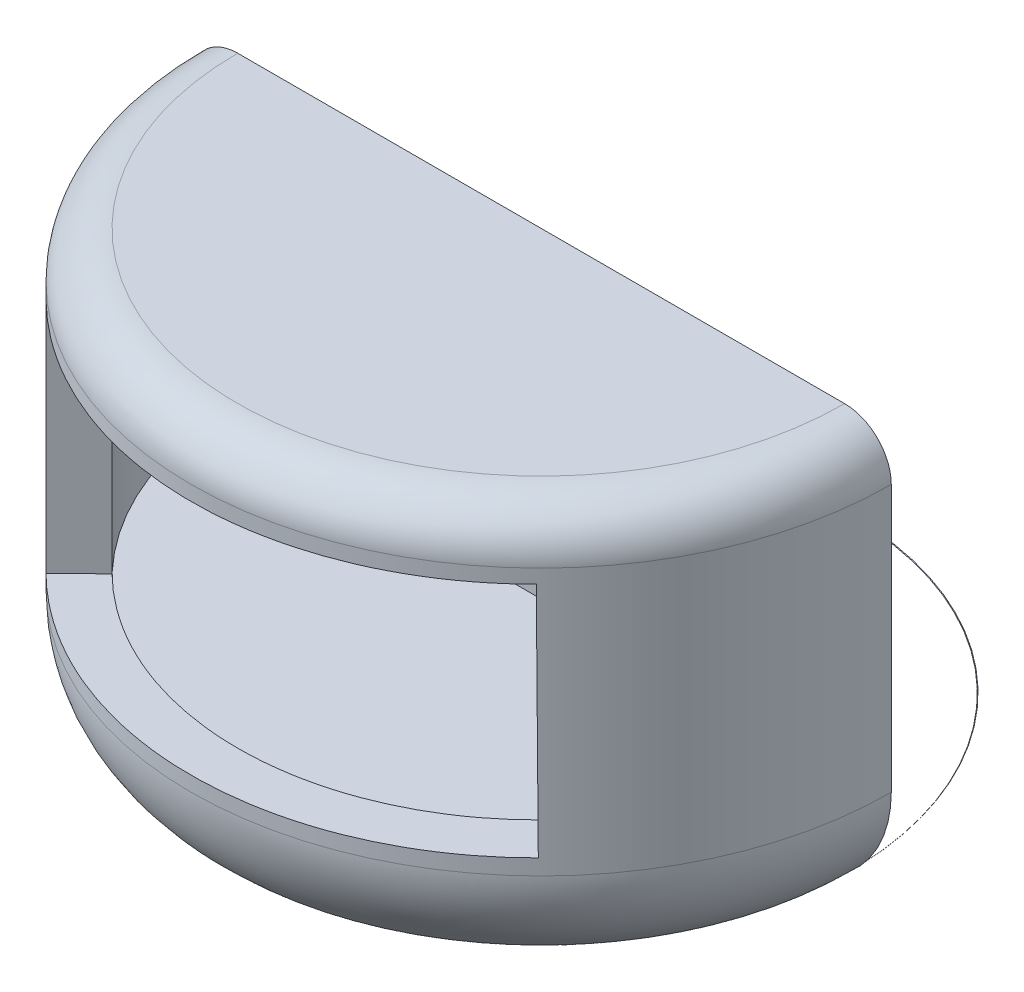
ISO-10303-21;
HEADER;
FILE_DESCRIPTION(('STEP AP214'),'2;1');
FILE_NAME('part.step','',(''),(''),'','','');
FILE_SCHEMA(('AUTOMOTIVE_DESIGN { 1 0 10303 214 1 1 1 1 }'));
ENDSEC;
DATA;
#1=APPLICATION_CONTEXT('core data for automotive mechanical design processes');
#2=APPLICATION_PROTOCOL_DEFINITION('international standard','automotive_design',2000,#1);
#3=PRODUCT_CONTEXT('',#1,'mechanical');
#4=PRODUCT('Part','Part','',(#3));
#5=PRODUCT_RELATED_PRODUCT_CATEGORY('part','',(#4));
#6=PRODUCT_DEFINITION_FORMATION('','',#4);
#7=PRODUCT_DEFINITION_CONTEXT('part definition',#1,'design');
#8=PRODUCT_DEFINITION('design','',#6,#7);
#9=PRODUCT_DEFINITION_SHAPE('','',#8);
#10=(LENGTH_UNIT() NAMED_UNIT(*) SI_UNIT(.MILLI.,.METRE.));
#11=(NAMED_UNIT(*) PLANE_ANGLE_UNIT() SI_UNIT($,.RADIAN.));
#12=(NAMED_UNIT(*) SI_UNIT($,.STERADIAN.) SOLID_ANGLE_UNIT());
#13=UNCERTAINTY_MEASURE_WITH_UNIT(LENGTH_MEASURE(1.E-05),#10,'distance_accuracy_value','');
#14=(GEOMETRIC_REPRESENTATION_CONTEXT(3) GLOBAL_UNCERTAINTY_ASSIGNED_CONTEXT((#13)) GLOBAL_UNIT_ASSIGNED_CONTEXT((#10,
#11,#12)) REPRESENTATION_CONTEXT('',''));
#15=CARTESIAN_POINT('',(0.,0.,0.));
#16=DIRECTION('',(0.,0.,1.));
#17=DIRECTION('',(1.,0.,0.));
#18=AXIS2_PLACEMENT_3D('',#15,#16,#17);
#19=CARTESIAN_POINT('',(0.,0.,0.));
#20=DIRECTION('',(0.,0.,1.));
#21=DIRECTION('',(1.,0.,0.));
#22=AXIS2_PLACEMENT_3D('',#19,#20,#21);
#23=PLANE('',#22);
#24=DIRECTION('',(0.,-1.,0.));
#25=VECTOR('',#24,1.);
#26=CARTESIAN_POINT('',(-30.,0.,0.));
#27=LINE('',#26,#25);
#28=CARTESIAN_POINT('',(-30.,27.1583373621054,0.));
#29=VERTEX_POINT('',#28);
#30=CARTESIAN_POINT('',(-30.,49.9999999999736,0.));
#31=VERTEX_POINT('',#30);
#32=EDGE_CURVE('E54',#29,#31,#27,.F.);
#33=ORIENTED_EDGE('',*,*,#32,.T.);
#34=CARTESIAN_POINT('',(-26.,49.9999999999736,0.));
#35=DIRECTION('',(0.,0.,1.));
#36=DIRECTION('',(1.,0.,0.));
#37=AXIS2_PLACEMENT_3D('',#34,#35,#36);
#38=CIRCLE('',#37,4.);
#39=CARTESIAN_POINT('',(-26.,53.9999999999736,0.));
#40=VERTEX_POINT('',#39);
#41=EDGE_CURVE('E130',#31,#40,#38,.F.);
#42=ORIENTED_EDGE('',*,*,#41,.T.);
#43=DIRECTION('',(-1.,0.,0.));
#44=VECTOR('',#43,1.);
#45=CARTESIAN_POINT('',(26.,53.9999999999736,0.));
#46=LINE('',#45,#44);
#47=CARTESIAN_POINT('',(26.,53.9999999999736,0.));
#48=VERTEX_POINT('',#47);
#49=EDGE_CURVE('E154',#48,#40,#46,.T.);
#50=ORIENTED_EDGE('',*,*,#49,.F.);
#51=CARTESIAN_POINT('',(26.,49.9999999999736,0.));
#52=DIRECTION('',(0.,0.,1.));
#53=DIRECTION('',(1.,0.,0.));
#54=AXIS2_PLACEMENT_3D('',#51,#52,#53);
#55=CIRCLE('',#54,4.);
#56=CARTESIAN_POINT('',(30.,49.9999999999736,0.));
#57=VERTEX_POINT('',#56);
#58=EDGE_CURVE('E155',#48,#57,#55,.F.);
#59=ORIENTED_EDGE('',*,*,#58,.T.);
#60=DIRECTION('',(0.,-1.,0.));
#61=VECTOR('',#60,1.);
#62=CARTESIAN_POINT('',(30.,0.,0.));
#63=LINE('',#62,#61);
#64=CARTESIAN_POINT('',(30.,27.1583373621054,0.));
#65=VERTEX_POINT('',#64);
#66=EDGE_CURVE('E138',#57,#65,#63,.T.);
#67=ORIENTED_EDGE('',*,*,#66,.T.);
#68=CARTESIAN_POINT('',(20.,27.1583373621054,0.));
#69=DIRECTION('',(0.,0.,1.));
#70=DIRECTION('',(1.,0.,0.));
#71=AXIS2_PLACEMENT_3D('',#68,#69,#70);
#72=CIRCLE('',#71,10.);
#73=CARTESIAN_POINT('',(26.471866147965,19.5350212488365,0.));
#74=VERTEX_POINT('',#73);
#75=EDGE_CURVE('E293',#65,#74,#72,.F.);
#76=ORIENTED_EDGE('',*,*,#75,.T.);
#77=DIRECTION('',(-1.,0.,0.));
#78=VECTOR('',#77,1.);
#79=CARTESIAN_POINT('',(17.5,19.5350212488365,0.));
#80=LINE('',#79,#78);
#81=CARTESIAN_POINT('',(-26.471866147965,19.5350212488365,0.));
#82=VERTEX_POINT('',#81);
#83=EDGE_CURVE('E13',#74,#82,#80,.T.);
#84=ORIENTED_EDGE('',*,*,#83,.T.);
#85=CARTESIAN_POINT('',(-20.,27.1583373621054,0.));
#86=DIRECTION('',(0.,0.,1.));
#87=DIRECTION('',(1.,0.,0.));
#88=AXIS2_PLACEMENT_3D('',#85,#86,#87);
#89=CIRCLE('',#88,10.);
#90=EDGE_CURVE('E133',#82,#29,#89,.F.);
#91=ORIENTED_EDGE('',*,*,#90,.T.);
#92=EDGE_LOOP('',(#33,#42,#50,#59,#67,#76,#84,#91));
#93=FACE_BOUND('',#92,.T.);
#94=ADVANCED_FACE('F51',(#93),#23,.F.);
#95=CARTESIAN_POINT('',(0.,27.9999999999736,0.));
#96=DIRECTION('',(0.,-1.,0.));
#97=DIRECTION('',(0.,0.,-1.));
#98=AXIS2_PLACEMENT_3D('',#95,#96,#97);
#99=PLANE('',#98);
#100=CARTESIAN_POINT('',(0.,27.9999999999736,0.));
#101=DIRECTION('',(0.,-1.,0.));
#102=DIRECTION('',(0.,0.,-1.));
#103=AXIS2_PLACEMENT_3D('',#100,#101,#102);
#104=CIRCLE('',#103,26.);
#105=CARTESIAN_POINT('',(25.9566947048348,27.9999999999736,1.5));
#106=VERTEX_POINT('',#105);
#107=CARTESIAN_POINT('',(-25.9566947048348,27.9999999999736,1.5));
#108=VERTEX_POINT('',#107);
#109=EDGE_CURVE('E265',#106,#108,#104,.T.);
#110=ORIENTED_EDGE('',*,*,#109,.F.);
#111=DIRECTION('',(1.,0.,0.));
#112=VECTOR('',#111,1.);
#113=CARTESIAN_POINT('',(-25.9566947048348,27.9999999999736,1.5));
#114=LINE('',#113,#112);
#115=EDGE_CURVE('E269',#108,#106,#114,.T.);
#116=ORIENTED_EDGE('',*,*,#115,.F.);
#117=EDGE_LOOP('',(#110,#116));
#118=FACE_BOUND('',#117,.T.);
#119=ADVANCED_FACE('F234',(#118),#99,.F.);
#120=CARTESIAN_POINT('',(-25.9566947048348,27.9999999999736,1.5));
#121=DIRECTION('',(0.,0.,1.));
#122=DIRECTION('',(1.,0.,0.));
#123=AXIS2_PLACEMENT_3D('',#120,#121,#122);
#124=PLANE('',#123);
#125=DIRECTION('',(1.,0.,0.));
#126=VECTOR('',#125,1.);
#127=CARTESIAN_POINT('',(-25.9566947048348,49.9999999999736,1.5));
#128=LINE('',#127,#126);
#129=CARTESIAN_POINT('',(-25.9566947048348,49.9999999999736,1.5));
#130=VERTEX_POINT('',#129);
#131=CARTESIAN_POINT('',(25.9566947048348,49.9999999999736,1.5));
#132=VERTEX_POINT('',#131);
#133=EDGE_CURVE('E257',#130,#132,#128,.T.);
#134=ORIENTED_EDGE('',*,*,#133,.F.);
#135=DIRECTION('',(0.,1.,0.));
#136=VECTOR('',#135,1.);
#137=CARTESIAN_POINT('',(-25.9566947048348,27.9999999999736,1.5));
#138=LINE('',#137,#136);
#139=EDGE_CURVE('E160',#108,#130,#138,.T.);
#140=ORIENTED_EDGE('',*,*,#139,.F.);
#141=ORIENTED_EDGE('',*,*,#115,.T.);
#142=DIRECTION('',(0.,1.,0.));
#143=VECTOR('',#142,1.);
#144=CARTESIAN_POINT('',(25.9566947048348,27.9999999999736,1.5));
#145=LINE('',#144,#143);
#146=EDGE_CURVE('E271',#106,#132,#145,.T.);
#147=ORIENTED_EDGE('',*,*,#146,.T.);
#148=EDGE_LOOP('',(#134,#140,#141,#147));
#149=FACE_BOUND('',#148,.T.);
#150=ADVANCED_FACE('F238',(#149),#124,.T.);
#151=CARTESIAN_POINT('',(0.,49.9999999999736,0.));
#152=DIRECTION('',(0.,-1.,0.));
#153=DIRECTION('',(0.,0.,-1.));
#154=AXIS2_PLACEMENT_3D('',#151,#152,#153);
#155=PLANE('',#154);
#156=CARTESIAN_POINT('',(0.,49.9999999999736,0.));
#157=DIRECTION('',(0.,-1.,0.));
#158=DIRECTION('',(0.,0.,-1.));
#159=AXIS2_PLACEMENT_3D('',#156,#157,#158);
#160=CIRCLE('',#159,26.);
#161=EDGE_CURVE('E256',#132,#130,#160,.T.);
#162=ORIENTED_EDGE('',*,*,#161,.T.);
#163=ORIENTED_EDGE('',*,*,#133,.T.);
#164=EDGE_LOOP('',(#162,#163));
#165=FACE_BOUND('',#164,.T.);
#166=ADVANCED_FACE('F243',(#165),#155,.T.);
#167=CARTESIAN_POINT('',(0.,27.9999999999736,0.));
#168=DIRECTION('',(0.,1.,0.));
#169=DIRECTION('',(0.,0.,1.));
#170=AXIS2_PLACEMENT_3D('',#167,#168,#169);
#171=CYLINDRICAL_SURFACE('',#170,26.);
#172=ORIENTED_EDGE('',*,*,#161,.F.);
#173=ORIENTED_EDGE('',*,*,#146,.F.);
#174=ORIENTED_EDGE('',*,*,#109,.T.);
#175=ORIENTED_EDGE('',*,*,#139,.T.);
#176=EDGE_LOOP('',(#172,#173,#174,#175));
#177=FACE_BOUND('',#176,.T.);
#178=CARTESIAN_POINT('',(-18.7417440650638,28.4972696320562,18.0207388694151));
#179=CARTESIAN_POINT('',(-18.4882996910665,28.4949925427919,18.2843241295319));
#180=CARTESIAN_POINT('',(-18.2293213985512,28.492761904993,18.5425323261121));
#181=CARTESIAN_POINT('',(-17.7007135045541,28.4883969978906,19.0477934487578));
#182=CARTESIAN_POINT('',(-17.4310841568819,28.4862627262933,19.2948466403417));
#183=CARTESIAN_POINT('',(-16.6069677604475,28.4800105765759,20.0185657956522));
#184=CARTESIAN_POINT('',(-16.0371209634453,28.4760421833133,20.4779279563515));
#185=CARTESIAN_POINT('',(-14.8611835443312,28.4685374159322,21.3466435161279));
#186=CARTESIAN_POINT('',(-14.2551212327624,28.4650007107669,21.7560352358337));
#187=CARTESIAN_POINT('',(-13.3219773796418,28.4600365514383,22.3306619065837));
#188=CARTESIAN_POINT('',(-13.0069076634661,28.4584385897282,22.515634064853));
#189=CARTESIAN_POINT('',(-12.3691743495986,28.4553583377942,22.8721887698579));
#190=CARTESIAN_POINT('',(-12.0465088263086,28.4538760773216,23.0437678727159));
#191=CARTESIAN_POINT('',(-11.0678943363678,28.449606745937,23.5379643823344));
#192=CARTESIAN_POINT('',(-10.4014091600374,28.446997559641,23.8399906849518));
#193=CARTESIAN_POINT('',(-9.04535501319811,28.4422737051741,24.3868002428154));
#194=CARTESIAN_POINT('',(-8.35578603989758,28.4401590370629,24.6315834911387));
#195=CARTESIAN_POINT('',(-7.30797156898737,28.4373693488168,24.9545035936869));
#196=CARTESIAN_POINT('',(-6.95642106320122,28.4365031048133,25.0547755778289));
#197=CARTESIAN_POINT('',(-6.24949876848898,28.434899592118,25.2403900089665));
#198=CARTESIAN_POINT('',(-5.89412798144716,28.4341622904461,25.3257362735706));
#199=CARTESIAN_POINT('',(-4.82302947503477,28.4321454902131,25.5591907236533));
#200=CARTESIAN_POINT('',(-4.10224602789471,28.4310609112609,25.6847360001692));
#201=CARTESIAN_POINT('',(-2.65276874460171,28.4294202969172,25.874645061075));
#202=CARTESIAN_POINT('',(-1.92407501327557,28.4288642545302,25.9390096552304));
#203=CARTESIAN_POINT('',(-0.463827136891702,28.4282843729651,26.006133749332));
#204=CARTESIAN_POINT('',(0.267727020078261,28.4282605360057,26.0088929924491));
#205=CARTESIAN_POINT('',(1.72855236241819,28.4287453424103,25.952774308005));
#206=CARTESIAN_POINT('',(2.45782325024868,28.4292540524939,25.8938886573215));
#207=CARTESIAN_POINT('',(3.90880528423464,28.4308004119058,25.7148900639795));
#208=CARTESIAN_POINT('',(4.63051651098478,28.4318380555892,25.5947777747467));
#209=CARTESIAN_POINT('',(6.06130555464034,28.434434995276,25.2941693643052));
#210=CARTESIAN_POINT('',(6.7703824302864,28.4359943299757,25.1136687638134));
#211=CARTESIAN_POINT('',(8.17083838230549,28.4396236357102,24.6935588304715));
#212=CARTESIAN_POINT('',(8.86221672554242,28.4416936278605,24.4539470533857));
#213=CARTESIAN_POINT('',(10.2221370461921,28.446328805239,23.917402329579));
#214=CARTESIAN_POINT('',(10.8906849623145,28.4488938605174,23.6204844252252));
#215=CARTESIAN_POINT('',(12.2003250030631,28.4545011137229,22.9714167897574));
#216=CARTESIAN_POINT('',(12.8414215173077,28.4575432349994,22.619275931378));
#217=CARTESIAN_POINT('',(13.949696290459,28.4633402729078,21.9482393702817));
#218=CARTESIAN_POINT('',(14.4233271027844,28.4660037038536,21.6399336482851));
#219=CARTESIAN_POINT('',(15.3494529195052,28.4715910425169,20.9931705052372));
#220=CARTESIAN_POINT('',(15.8019513113806,28.4745149082673,20.6547179421203));
#221=CARTESIAN_POINT('',(16.683540327506,28.4806082600359,19.949380784186));
#222=CARTESIAN_POINT('',(17.1126515906576,28.4837775233112,19.5825219732147));
#223=CARTESIAN_POINT('',(17.9461860417229,28.4903509154557,18.8216171787728));
#224=CARTESIAN_POINT('',(18.3506049323904,28.4937550849877,18.4275664883383));
#225=CARTESIAN_POINT('',(18.7417440650638,28.4972696320562,18.020738869415));
#226=B_SPLINE_CURVE_WITH_KNOTS('',3,(#178,#179,#180,#181,#182,#183,#184,#185,#186,#187,#188,
#189,#190,#191,#192,#193,#194,#195,#196,#197,#198,#199,#200,#201,#202,#203,#204,#205,#206,#207,
#208,#209,#210,#211,#212,#213,#214,#215,#216,#217,#218,#219,#220,#221,#222,#223,#224,#225),
.UNSPECIFIED.,.F.,.F.,(4,2,2,2,2,2,2,2,2,2,2,2,2,2,2,2,2,2,2,2,2,2,2,4),(0.,1.09685509487915,
2.1936840679525,4.38677520568185,6.57817382701418,7.67396270481441,8.7700324308167,
10.9624588135608,13.1548854614518,14.2513161669119,15.3474660226409,17.5395480070989,
19.7316009775408,21.9236630865232,24.1159998588086,26.3083132344256,28.5007892602309,
30.6933559597008,32.8853479100357,35.0769880307017,36.7712787927738,38.4652970249931,
40.1577952566729,41.850587201394),.UNSPECIFIED.);
#227=CARTESIAN_POINT('',(-18.2621120010512,28.493072082582,18.5066276036738));
#228=VERTEX_POINT('',#227);
#229=CARTESIAN_POINT('',(18.2621120010512,28.493072082582,18.5066276036738));
#230=VERTEX_POINT('',#229);
#231=EDGE_CURVE('E179',#228,#230,#226,.T.);
#232=ORIENTED_EDGE('',*,*,#231,.T.);
#233=CARTESIAN_POINT('',(0.,0.,0.));
#234=DIRECTION('',(-0.707106781186546,-0.00605127601328301,0.707080887917792));
#235=DIRECTION('',(-0.00427897664819917,0.999981690861693,0.00427881995801418));
#236=AXIS2_PLACEMENT_3D('',#233,#234,#235);
#237=ELLIPSE('',#236,4296.6144566746,26.);
#238=CARTESIAN_POINT('',(18.1744500113073,48.7967473879557,18.5927234902929));
#239=VERTEX_POINT('',#238);
#240=EDGE_CURVE('E282',#230,#239,#237,.T.);
#241=ORIENTED_EDGE('',*,*,#240,.T.);
#242=CARTESIAN_POINT('',(18.6926780343224,48.8012794172138,18.0716293649787));
#243=CARTESIAN_POINT('',(18.4385183006826,48.7989929881626,18.3345241778891));
#244=CARTESIAN_POINT('',(18.1788393018588,48.7967534481328,18.5920269194329));
#245=CARTESIAN_POINT('',(17.6488603890173,48.7923716266351,19.0958482509664));
#246=CARTESIAN_POINT('',(17.3785607280892,48.7902293428522,19.342167107166));
#247=CARTESIAN_POINT('',(16.5524808960797,48.7839545173154,20.0636419775139));
#248=CARTESIAN_POINT('',(15.9813881137986,48.779972816347,20.5214525481317));
#249=CARTESIAN_POINT('',(14.8030935364394,48.7724451659235,21.3869677255568));
#250=CARTESIAN_POINT('',(14.1959198635624,48.7688988835366,21.7947106153546));
#251=CARTESIAN_POINT('',(13.2612162819737,48.7639232139971,22.3667987310029));
#252=CARTESIAN_POINT('',(12.9456445236186,48.7623218914081,22.5509137828105));
#253=CARTESIAN_POINT('',(12.3069435375499,48.7592358746595,22.9057336543007));
#254=CARTESIAN_POINT('',(11.9838123935959,48.7577512104968,23.0764350248637));
#255=CARTESIAN_POINT('',(11.0038567632233,48.7534761131265,23.5679695759369));
#256=CARTESIAN_POINT('',(10.3365520569011,48.7508650113284,23.8681830323589));
#257=CARTESIAN_POINT('',(8.97901450796613,48.7461412109073,24.4113042088928));
#258=CARTESIAN_POINT('',(8.28878166260844,48.7440285123439,24.654211922144));
#259=CARTESIAN_POINT('',(7.24009274752019,48.7412446868845,24.9742818639636));
#260=CARTESIAN_POINT('',(6.88827148981523,48.7403808832524,25.0735974423311));
#261=CARTESIAN_POINT('',(6.18084831027991,48.7387832145626,25.257288777315));
#262=CARTESIAN_POINT('',(5.82524737994926,48.7380493162778,25.341668354245));
#263=CARTESIAN_POINT('',(4.75351990981642,48.73604416569,25.5722093376212));
#264=CARTESIAN_POINT('',(4.03239902369544,48.7349692727988,25.6957942502795));
#265=CARTESIAN_POINT('',(2.58241597589015,48.7333518047302,25.8817611640204));
#266=CARTESIAN_POINT('',(1.8535539458456,48.7328092205154,25.9441442041746));
#267=CARTESIAN_POINT('',(0.393136870817819,48.7322599297667,26.0072983202984));
#268=CARTESIAN_POINT('',(-0.338418185793069,48.7322532255494,26.0080691299327));
#269=CARTESIAN_POINT('',(-1.79908510633138,48.7327758549879,25.947980370527));
#270=CARTESIAN_POINT('',(-2.52819662640449,48.7333052611493,25.8871124652528));
#271=CARTESIAN_POINT('',(-3.97869297799724,48.7348964270782,25.7041696246165));
#272=CARTESIAN_POINT('',(-4.70007789681178,48.7359581808247,25.5820953815083));
#273=CARTESIAN_POINT('',(-6.13005836964721,48.7386065964008,25.2775954202985));
#274=CARTESIAN_POINT('',(-6.83865282056773,48.7401933032785,25.0951645227791));
#275=CARTESIAN_POINT('',(-8.23798473477539,48.7438804115872,24.6712398080974));
#276=CARTESIAN_POINT('',(-8.92872140960019,48.7459808356575,24.4297433879625));
#277=CARTESIAN_POINT('',(-10.287179921111,48.7506796202713,23.8894984941972));
#278=CARTESIAN_POINT('',(-10.9549084417728,48.7532778347407,23.5907668159661));
#279=CARTESIAN_POINT('',(-12.262755702936,48.7589539407729,22.9381496953599));
#280=CARTESIAN_POINT('',(-12.9028791580065,48.7620317500099,22.5842737188885));
#281=CARTESIAN_POINT('',(-13.9992653179497,48.7678408864245,21.9163561233506));
#282=CARTESIAN_POINT('',(-14.4624072566155,48.7704746646683,21.6135310673257));
#283=CARTESIAN_POINT('',(-15.368383397481,48.7759933661601,20.9790026560228));
#284=CARTESIAN_POINT('',(-15.811221027331,48.7788782467784,20.6473042025838));
#285=CARTESIAN_POINT('',(-16.6744079391347,48.7848847480169,19.9566846542299));
#286=CARTESIAN_POINT('',(-17.0947789194392,48.7880061329073,19.5977906657536));
#287=CARTESIAN_POINT('',(-17.911893893153,48.7944758580104,18.853904468854));
#288=CARTESIAN_POINT('',(-18.3086336145199,48.7978242390268,18.4689075683018));
#289=CARTESIAN_POINT('',(-18.6926780343224,48.8012794172138,18.0716293649787));
#290=B_SPLINE_CURVE_WITH_KNOTS('',3,(#242,#243,#244,#245,#246,#247,#248,#249,#250,#251,#252,
#253,#254,#255,#256,#257,#258,#259,#260,#261,#262,#263,#264,#265,#266,#267,#268,#269,#270,#271,
#272,#273,#274,#275,#276,#277,#278,#279,#280,#281,#282,#283,#284,#285,#286,#287,#288,#289),
.UNSPECIFIED.,.F.,.F.,(4,2,2,2,2,2,2,2,2,2,2,2,2,2,2,2,2,2,2,2,2,2,2,4),(0.,1.09685368222676,
2.19368124235452,4.38676957048103,6.57817042657168,7.67396042149795,8.77003126600636,
10.9624603476552,13.1548896917765,14.2513185454043,15.3474665491666,17.5395447463086,
19.7315857262003,21.9236361817716,24.1159831374671,26.3083052979114,28.5008156380836,
30.6934226179326,32.8853871709857,35.0769758716628,36.7360037193661,38.394750461048,
40.0518651036171,41.7092784146304),.UNSPECIFIED.);
#291=CARTESIAN_POINT('',(-18.1744500113073,48.7967473879557,18.5927234902929));
#292=VERTEX_POINT('',#291);
#293=EDGE_CURVE('E169',#239,#292,#290,.T.);
#294=ORIENTED_EDGE('',*,*,#293,.T.);
#295=CARTESIAN_POINT('',(0.,0.,0.));
#296=DIRECTION('',(-0.707106781186546,0.00605127601328301,-0.707080887917792));
#297=DIRECTION('',(0.00427897664819917,0.999981690861693,0.00427881995801418));
#298=AXIS2_PLACEMENT_3D('',#295,#296,#297);
#299=ELLIPSE('',#298,4296.6144566746,26.);
#300=EDGE_CURVE('E166',#228,#292,#299,.T.);
#301=ORIENTED_EDGE('',*,*,#300,.F.);
#302=EDGE_LOOP('',(#232,#241,#294,#301));
#303=FACE_BOUND('',#302,.T.);
#304=ADVANCED_FACE('F186',(#177,#303),#171,.F.);
#305=CARTESIAN_POINT('',(26.,53.9999999999736,0.));
#306=DIRECTION('',(0.,1.,0.));
#307=DIRECTION('',(0.,0.,1.));
#308=AXIS2_PLACEMENT_3D('',#305,#306,#307);
#309=PLANE('',#308);
#310=ORIENTED_EDGE('',*,*,#49,.T.);
#311=CARTESIAN_POINT('',(0.,53.9999999999736,0.));
#312=DIRECTION('',(0.,-1.,0.));
#313=DIRECTION('',(0.,0.,-1.));
#314=AXIS2_PLACEMENT_3D('',#311,#312,#313);
#315=CIRCLE('',#314,26.);
#316=EDGE_CURVE('E149',#48,#40,#315,.T.);
#317=ORIENTED_EDGE('',*,*,#316,.F.);
#318=EDGE_LOOP('',(#310,#317));
#319=FACE_BOUND('',#318,.T.);
#320=ADVANCED_FACE('F252',(#319),#309,.T.);
#321=CARTESIAN_POINT('',(0.,0.,0.));
#322=DIRECTION('',(-0.707106781186546,0.00605127601328301,-0.707080887917792));
#323=DIRECTION('',(-0.707080887917792,0.00250642880906008,0.707128231479986));
#324=AXIS2_PLACEMENT_3D('',#321,#322,#323);
#325=PLANE('',#324);
#326=CARTESIAN_POINT('',(0.,0.,0.));
#327=DIRECTION('',(-0.707106781186546,0.00605127601328301,-0.707080887917792));
#328=DIRECTION('',(-0.00427897664819917,-0.999981690861693,-0.00427881995801418));
#329=AXIS2_PLACEMENT_3D('',#326,#327,#328);
#330=ELLIPSE('',#329,4957.63206539377,30.);
#331=CARTESIAN_POINT('',(-21.002940125848,48.8067736936165,21.4214029902348));
#332=VERTEX_POINT('',#331);
#333=CARTESIAN_POINT('',(-21.0904980927388,28.5030980195073,21.3352030737976));
#334=VERTEX_POINT('',#333);
#335=EDGE_CURVE('E310',#332,#334,#330,.F.);
#336=ORIENTED_EDGE('',*,*,#335,.T.);
#337=DIRECTION('',(0.707080887917792,-0.00250642880906008,-0.707128231479986));
#338=VECTOR('',#337,1.);
#339=CARTESIAN_POINT('',(-17.7764557845647,28.4913505500769,18.0209388694151));
#340=LINE('',#339,#338);
#341=EDGE_CURVE('E73',#334,#228,#340,.T.);
#342=ORIENTED_EDGE('',*,*,#341,.T.);
#343=ORIENTED_EDGE('',*,*,#300,.T.);
#344=DIRECTION('',(-0.707080887917792,0.00250642880906008,0.707128231479986));
#345=VECTOR('',#344,1.);
#346=CARTESIAN_POINT('',(-22.603156976257,48.8124460709685,23.0217269853386));
#347=LINE('',#346,#345);
#348=EDGE_CURVE('E68',#292,#332,#347,.T.);
#349=ORIENTED_EDGE('',*,*,#348,.T.);
#350=EDGE_LOOP('',(#336,#342,#343,#349));
#351=FACE_BOUND('',#350,.T.);
#352=ADVANCED_FACE('F302',(#351),#325,.F.);
#353=CARTESIAN_POINT('',(0.,28.7033802257171,0.245646685164284));
#354=DIRECTION('',(0.,0.99996338138815,0.0085577966076478));
#355=DIRECTION('',(0.,-0.0085577966076478,0.99996338138815));
#356=AXIS2_PLACEMENT_3D('',#353,#354,#355);
#357=CONICAL_SURFACE('',#356,32.1394485311741,1.56223842572751);
#358=DIRECTION('',(-0.707080887917792,-0.00250642880906008,-0.707128231479986));
#359=VECTOR('',#358,1.);
#360=CARTESIAN_POINT('',(17.7764557845647,28.4913505500769,18.0209388694151));
#361=LINE('',#360,#359);
#362=CARTESIAN_POINT('',(21.0904980927388,28.5030980195073,21.3352030737976));
#363=VERTEX_POINT('',#362);
#364=EDGE_CURVE('E312',#363,#230,#361,.T.);
#365=ORIENTED_EDGE('',*,*,#364,.T.);
#366=ORIENTED_EDGE('',*,*,#231,.F.);
#367=ORIENTED_EDGE('',*,*,#341,.F.);
#368=CARTESIAN_POINT('',(21.7712381423798,28.5090955517403,20.6400869607613));
#369=CARTESIAN_POINT('',(21.4809541687887,28.5064536844701,20.9462802876514));
#370=CARTESIAN_POINT('',(21.184241251895,28.5038649592554,21.2463144673509));
#371=CARTESIAN_POINT('',(20.5784348671928,28.498797815631,21.833598292207));
#372=CARTESIAN_POINT('',(20.2693416943802,28.4963193945959,22.1208482416413));
#373=CARTESIAN_POINT('',(19.3243493646539,28.4890566877585,22.9625988393332));
#374=CARTESIAN_POINT('',(18.67058689524,28.4844435888759,23.4972589449532));
#375=CARTESIAN_POINT('',(17.3208397737497,28.4757127256145,24.5091698615322));
#376=CARTESIAN_POINT('',(16.6248883454237,28.4715945788928,24.9864649860592));
#377=CARTESIAN_POINT('',(15.5528903821732,28.4658085117941,25.6570729657616));
#378=CARTESIAN_POINT('',(15.1908638891878,28.4639449467615,25.8730610746795));
#379=CARTESIAN_POINT('',(14.4579400039519,28.4603505798404,26.2896500101365));
#380=CARTESIAN_POINT('',(14.0870403619082,28.4586198121009,26.4902468787925));
#381=CARTESIAN_POINT('',(12.9619237499236,28.4536312537893,27.0684233859672));
#382=CARTESIAN_POINT('',(12.1953823914176,28.4505777115754,27.4223305754372));
#383=CARTESIAN_POINT('',(10.6351993798727,28.4450388710311,28.0642852520255));
#384=CARTESIAN_POINT('',(9.84155772349319,28.4425535727707,28.3523327310252));
#385=CARTESIAN_POINT('',(8.6352005629979,28.4392652360305,28.7334528576715));
#386=CARTESIAN_POINT('',(8.23038996748307,28.4382423096787,28.8520106184576));
#387=CARTESIAN_POINT('',(7.41623813903055,28.4363448169533,29.0719311405598));
#388=CARTESIAN_POINT('',(7.00689809316624,28.4354702126446,29.1732982985593));
#389=CARTESIAN_POINT('',(5.77294087937658,28.4330708837685,29.4513819467634));
#390=CARTESIAN_POINT('',(4.94230660068062,28.4317704251841,29.6021058852708));
#391=CARTESIAN_POINT('',(3.27140569760785,28.4297780253945,29.8330262360481));
#392=CARTESIAN_POINT('',(2.43113911899371,28.4290860812996,29.9132229832492));
#393=CARTESIAN_POINT('',(0.746804405422418,28.4283153012537,30.0025568660928));
#394=CARTESIAN_POINT('',(-0.0972637438819451,28.4282364676185,30.0116937333287));
#395=CARTESIAN_POINT('',(-1.78324623660899,28.4286925827196,29.9588297113483));
#396=CARTESIAN_POINT('',(-2.6251603558213,28.4292275929378,29.8968216963483));
#397=CARTESIAN_POINT('',(-4.30076589350827,28.4309076620613,29.7021006562344));
#398=CARTESIAN_POINT('',(-5.13445738624926,28.4320527154517,29.5693882703157));
#399=CARTESIAN_POINT('',(-6.78773117351433,28.4349447897382,29.2341951234517));
#400=CARTESIAN_POINT('',(-7.60731283783726,28.436691837449,29.0317112546785));
#401=CARTESIAN_POINT('',(-9.22653287652685,28.4407755526133,28.5584062870017));
#402=CARTESIAN_POINT('',(-10.0261705644697,28.4431122403301,28.2875828395705));
#403=CARTESIAN_POINT('',(-11.5996296876067,28.4483580296167,27.679592928585));
#404=CARTESIAN_POINT('',(-12.3734558602886,28.4512670254603,27.3424387187255));
#405=CARTESIAN_POINT('',(-13.8898906650369,28.4576368701747,26.6041703436997));
#406=CARTESIAN_POINT('',(-14.6325034123789,28.4610976460069,26.203064643734));
#407=CARTESIAN_POINT('',(-15.9469955810132,28.4678558575143,25.4197845894247));
#408=CARTESIAN_POINT('',(-16.5250190869173,28.4710647907995,25.0478676821941));
#409=CARTESIAN_POINT('',(-17.654122473535,28.4778170524114,24.265277443718));
#410=CARTESIAN_POINT('',(-18.2052060156728,28.4813603351037,23.8546094015147));
#411=CARTESIAN_POINT('',(-19.2775246391255,28.4887624864455,22.9966969094113));
#412=CARTESIAN_POINT('',(-19.7987789390138,28.4926211479186,22.5494764712611));
#413=CARTESIAN_POINT('',(-20.8094888532861,28.5006382297398,21.6202935882683));
#414=CARTESIAN_POINT('',(-21.2989395375423,28.5047966963533,21.1383257812764));
#415=CARTESIAN_POINT('',(-21.7712381423798,28.5090955517403,20.6400869607613));
#416=B_SPLINE_CURVE_WITH_KNOTS('',3,(#368,#369,#370,#371,#372,#373,#374,#375,#376,#377,#378,
#379,#380,#381,#382,#383,#384,#385,#386,#387,#388,#389,#390,#391,#392,#393,#394,#395,#396,#397,
#398,#399,#400,#401,#402,#403,#404,#405,#406,#407,#408,#409,#410,#411,#412,#413,#414,#415),
.UNSPECIFIED.,.F.,.F.,(4,2,2,2,2,2,2,2,2,2,2,2,2,2,2,2,2,2,2,2,2,2,2,4),(0.,1.26560662262197,
2.53118310639022,5.06168203098283,7.59021344584406,8.85458249826941,10.1192756031284,
12.6489908689685,15.1787064466436,16.4438243552116,17.7086182065381,20.2379549253569,
22.7672796323738,25.2966138931241,27.8262015109962,30.3557662607998,32.885443699454,
35.415208083719,37.9445055669503,40.4734685269125,42.5339506747915,44.5941519984511,
46.6530106617604,48.712187727204),.UNSPECIFIED.);
#417=EDGE_CURVE('E212',#363,#334,#416,.T.);
#418=ORIENTED_EDGE('',*,*,#417,.F.);
#419=EDGE_LOOP('',(#365,#366,#367,#418));
#420=FACE_BOUND('',#419,.T.);
#421=ADVANCED_FACE('F197',(#420),#357,.F.);
#422=CARTESIAN_POINT('',(0.,0.,0.));
#423=DIRECTION('',(-0.707106781186546,-0.00605127601328301,0.707080887917792));
#424=DIRECTION('',(0.707080887917792,0.00250642880906008,0.707128231479986));
#425=AXIS2_PLACEMENT_3D('',#422,#423,#424);
#426=PLANE('',#425);
#427=DIRECTION('',(0.707080887917792,0.00250642880906008,0.707128231479986));
#428=VECTOR('',#427,1.);
#429=CARTESIAN_POINT('',(22.603156976257,48.8124460709685,23.0217269853386));
#430=LINE('',#429,#428);
#431=CARTESIAN_POINT('',(21.002940125848,48.8067736936166,21.4214029902348));
#432=VERTEX_POINT('',#431);
#433=EDGE_CURVE('E315',#239,#432,#430,.T.);
#434=ORIENTED_EDGE('',*,*,#433,.F.);
#435=ORIENTED_EDGE('',*,*,#240,.F.);
#436=ORIENTED_EDGE('',*,*,#364,.F.);
#437=CARTESIAN_POINT('',(0.,0.,0.));
#438=DIRECTION('',(-0.707106781186546,-0.00605127601328301,0.707080887917792));
#439=DIRECTION('',(0.00427897664819917,-0.999981690861693,-0.00427881995801418));
#440=AXIS2_PLACEMENT_3D('',#437,#438,#439);
#441=ELLIPSE('',#440,4957.63206539377,30.);
#442=EDGE_CURVE('E213',#432,#363,#441,.F.);
#443=ORIENTED_EDGE('',*,*,#442,.F.);
#444=EDGE_LOOP('',(#434,#435,#436,#443));
#445=FACE_BOUND('',#444,.T.);
#446=ADVANCED_FACE('F194',(#445),#426,.T.);
#447=CARTESIAN_POINT('',(0.,48.9459769084309,0.418885054134185));
#448=DIRECTION('',(0.,0.99996338138815,0.0085577966076478));
#449=DIRECTION('',(0.,-0.0085577966076478,0.99996338138815));
#450=AXIS2_PLACEMENT_3D('',#447,#448,#449);
#451=CONICAL_SURFACE('',#450,24.9659474785535,1.56223842572751);
#452=ORIENTED_EDGE('',*,*,#348,.F.);
#453=ORIENTED_EDGE('',*,*,#293,.F.);
#454=ORIENTED_EDGE('',*,*,#433,.T.);
#455=CARTESIAN_POINT('',(-21.6715421304156,48.8126460709685,20.7447405789906));
#456=CARTESIAN_POINT('',(-21.3797869945719,48.8100009674065,21.0495310424372));
#457=CARTESIAN_POINT('',(-21.081632692282,48.8074095785825,21.3481314884241));
#458=CARTESIAN_POINT('',(-20.4730053281116,48.8023382578176,21.9324884123237));
#459=CARTESIAN_POINT('',(-20.1625325597654,48.7998583232238,22.2182451959398));
#460=CARTESIAN_POINT('',(-19.213498070893,48.792592808096,23.055431298539));
#461=CARTESIAN_POINT('',(-18.5571689086207,48.7879801452426,23.5869343438172));
#462=CARTESIAN_POINT('',(-17.2025629800129,48.7792547621115,24.5923306533803));
#463=CARTESIAN_POINT('',(-16.5043190568818,48.7751416578415,25.0662681661838));
#464=CARTESIAN_POINT('',(-15.4291009866031,48.7693665979428,25.7317048742889));
#465=CARTESIAN_POINT('',(-15.0660375258502,48.7675072761409,25.9459466762407));
#466=CARTESIAN_POINT('',(-14.3311139083453,48.7639225382148,26.3590003896615));
#467=CARTESIAN_POINT('',(-13.9592515208731,48.7621971565324,26.5578083324184));
#468=CARTESIAN_POINT('',(-12.831360198303,48.7572264600469,27.1305586074829));
#469=CARTESIAN_POINT('',(-12.0631210089795,48.7541870980628,27.4807692831591));
#470=CARTESIAN_POINT('',(-10.4998598482853,48.7486810678605,28.1152008480897));
#471=CARTESIAN_POINT('',(-9.70483787366176,48.7462143997119,28.3994217293295));
#472=CARTESIAN_POINT('',(-8.49665786152975,48.7429572492504,28.7747251255027));
#473=CARTESIAN_POINT('',(-8.09128190478112,48.7419452617721,28.8913307387701));
#474=CARTESIAN_POINT('',(-7.27608228114079,48.7400707031056,29.1073254351692));
#475=CARTESIAN_POINT('',(-6.86625978012207,48.7392080937109,29.2067189206428));
#476=CARTESIAN_POINT('',(-5.63098071331321,48.7368463105196,29.4788533864181));
#477=CARTESIAN_POINT('',(-4.79963237611449,48.7355729655769,29.6255732804743));
#478=CARTESIAN_POINT('',(-3.12764838993484,48.7336387632705,29.8484396970525));
#479=CARTESIAN_POINT('',(-2.28701284141766,48.7329778992878,29.9245869822337));
#480=CARTESIAN_POINT('',(-0.602282384225973,48.7322730211,30.0058057504876));
#481=CARTESIAN_POINT('',(0.24181253842195,48.7322290093891,30.0108769461799));
#482=CARTESIAN_POINT('',(1.92752038439134,48.7327582699505,29.9498935182605));
#483=CARTESIAN_POINT('',(2.76913300517818,48.7333316145805,29.8838305573073));
#484=CARTESIAN_POINT('',(4.44379397931097,48.7350915925695,29.6810389910836));
#485=CARTESIAN_POINT('',(5.27684241950598,48.7362782197029,29.544311103146));
#486=CARTESIAN_POINT('',(6.92851033926871,48.7392564131658,29.201151394295));
#487=CARTESIAN_POINT('',(7.74712888405779,48.7410480185357,28.9947150749546));
#488=CARTESIAN_POINT('',(9.3640966579392,48.745223505797,28.5135970238224));
#489=CARTESIAN_POINT('',(10.1624450926396,48.7476074108615,28.2389126219032));
#490=CARTESIAN_POINT('',(11.7329615911867,48.7529497811122,27.6233390885631));
#491=CARTESIAN_POINT('',(12.5051358187595,48.7559081099086,27.2824656729147));
#492=CARTESIAN_POINT('',(14.0179509047387,48.7623784731664,26.536916251395));
#493=CARTESIAN_POINT('',(14.7585965233391,48.7658904236627,26.1322499206889));
#494=CARTESIAN_POINT('',(16.0486797728095,48.7726352648865,25.3550698415367));
#495=CARTESIAN_POINT('',(16.6051537143588,48.7757673957196,24.9941666801595));
#496=CARTESIAN_POINT('',(17.6929156009732,48.7823442778698,24.2363364786094));
#497=CARTESIAN_POINT('',(18.2242073969544,48.7857889811513,23.8394149736841));
#498=CARTESIAN_POINT('',(19.2588951990072,48.7929732502108,23.0115937696148));
#499=CARTESIAN_POINT('',(19.7623137942419,48.7967125710863,22.580722291564));
#500=CARTESIAN_POINT('',(20.7396357253366,48.8044725615139,21.6865577841832));
#501=CARTESIAN_POINT('',(21.2135340949314,48.8084932781656,21.2232593272687));
#502=CARTESIAN_POINT('',(21.6715421304156,48.8126460709685,20.7447405789906));
#503=B_SPLINE_CURVE_WITH_KNOTS('',3,(#455,#456,#457,#458,#459,#460,#461,#462,#463,#464,#465,
#466,#467,#468,#469,#470,#471,#472,#473,#474,#475,#476,#477,#478,#479,#480,#481,#482,#483,#484,
#485,#486,#487,#488,#489,#490,#491,#492,#493,#494,#495,#496,#497,#498,#499,#500,#501,#502),
.UNSPECIFIED.,.F.,.F.,(4,2,2,2,2,2,2,2,2,2,2,2,2,2,2,2,2,2,2,2,2,2,2,4),(0.,1.26560365306733,
2.53117716639918,5.061670176897,7.59020561254473,8.85457667583331,10.119271793977,
12.6489922418919,15.1787129970468,16.4438271827044,17.7086173109479,20.2379464200531,
22.7672481950569,25.2965601967236,27.826168680903,30.3557514870583,32.8854975635445,
35.4153426290129,37.9445877465853,40.473449634093,42.461868280687,44.4499818657872,
46.4364599112237,48.4232712495284),.UNSPECIFIED.);
#504=EDGE_CURVE('E202',#332,#432,#503,.T.);
#505=ORIENTED_EDGE('',*,*,#504,.F.);
#506=EDGE_LOOP('',(#452,#453,#454,#505));
#507=FACE_BOUND('',#506,.T.);
#508=ADVANCED_FACE('F190',(#507),#451,.T.);
#509=CARTESIAN_POINT('',(0.,49.9999999999736,0.));
#510=DIRECTION('',(0.,-1.,0.));
#511=DIRECTION('',(0.,0.,-1.));
#512=AXIS2_PLACEMENT_3D('',#509,#510,#511);
#513=TOROIDAL_SURFACE('',#512,26.,4.);
#514=ORIENTED_EDGE('',*,*,#41,.F.);
#515=CARTESIAN_POINT('',(0.,49.9999999999736,0.));
#516=DIRECTION('',(0.,-1.,0.));
#517=DIRECTION('',(0.,0.,-1.));
#518=AXIS2_PLACEMENT_3D('',#515,#516,#517);
#519=CIRCLE('',#518,30.);
#520=EDGE_CURVE('E140',#57,#31,#519,.T.);
#521=ORIENTED_EDGE('',*,*,#520,.F.);
#522=ORIENTED_EDGE('',*,*,#58,.F.);
#523=ORIENTED_EDGE('',*,*,#316,.T.);
#524=EDGE_LOOP('',(#514,#521,#522,#523));
#525=FACE_BOUND('',#524,.T.);
#526=ADVANCED_FACE('F151',(#525),#513,.T.);
#527=CARTESIAN_POINT('',(0.,0.,0.));
#528=DIRECTION('',(0.,-1.,0.));
#529=DIRECTION('',(0.,0.,-1.));
#530=AXIS2_PLACEMENT_3D('',#527,#528,#529);
#531=CYLINDRICAL_SURFACE('',#530,30.);
#532=ORIENTED_EDGE('',*,*,#32,.F.);
#533=CARTESIAN_POINT('',(0.,27.1583373621054,0.));
#534=DIRECTION('',(0.,-1.,0.));
#535=DIRECTION('',(0.,0.,-1.));
#536=AXIS2_PLACEMENT_3D('',#533,#534,#535);
#537=CIRCLE('',#536,30.);
#538=EDGE_CURVE('E148',#65,#29,#537,.T.);
#539=ORIENTED_EDGE('',*,*,#538,.F.);
#540=ORIENTED_EDGE('',*,*,#66,.F.);
#541=ORIENTED_EDGE('',*,*,#520,.T.);
#542=EDGE_LOOP('',(#532,#539,#540,#541));
#543=FACE_BOUND('',#542,.T.);
#544=ORIENTED_EDGE('',*,*,#504,.T.);
#545=ORIENTED_EDGE('',*,*,#442,.T.);
#546=ORIENTED_EDGE('',*,*,#417,.T.);
#547=ORIENTED_EDGE('',*,*,#335,.F.);
#548=EDGE_LOOP('',(#544,#545,#546,#547));
#549=FACE_BOUND('',#548,.T.);
#550=ADVANCED_FACE('F141',(#543,#549),#531,.T.);
#551=CARTESIAN_POINT('',(0.,19.5350212488365,0.));
#552=DIRECTION('',(0.,-1.,0.));
#553=DIRECTION('',(0.,0.,-1.));
#554=AXIS2_PLACEMENT_3D('',#551,#552,#553);
#555=PLANE('',#554);
#556=ORIENTED_EDGE('',*,*,#83,.F.);
#557=CARTESIAN_POINT('',(0.,19.5350212488365,0.));
#558=DIRECTION('',(0.,-1.,0.));
#559=DIRECTION('',(0.,0.,-1.));
#560=AXIS2_PLACEMENT_3D('',#557,#558,#559);
#561=CIRCLE('',#560,26.471866147965);
#562=EDGE_CURVE('E60',#82,#74,#561,.F.);
#563=ORIENTED_EDGE('',*,*,#562,.F.);
#564=EDGE_LOOP('',(#556,#563));
#565=FACE_BOUND('',#564,.T.);
#566=ADVANCED_FACE('F224',(#565),#555,.T.);
#567=CARTESIAN_POINT('',(0.,27.1583373621054,0.));
#568=DIRECTION('',(0.,-1.,0.));
#569=DIRECTION('',(0.,0.,-1.));
#570=AXIS2_PLACEMENT_3D('',#567,#568,#569);
#571=TOROIDAL_SURFACE('',#570,20.,10.);
#572=ORIENTED_EDGE('',*,*,#90,.F.);
#573=ORIENTED_EDGE('',*,*,#562,.T.);
#574=ORIENTED_EDGE('',*,*,#75,.F.);
#575=ORIENTED_EDGE('',*,*,#538,.T.);
#576=EDGE_LOOP('',(#572,#573,#574,#575));
#577=FACE_BOUND('',#576,.T.);
#578=ADVANCED_FACE('F227',(#577),#571,.T.);
#579=CLOSED_SHELL('',(#94,#119,#150,#166,#304,#320,#352,#421,#446,#508,#526,#550,#566,#578));
#580=MANIFOLD_SOLID_BREP('B2',#579);
#581=CARTESIAN_POINT('',(0.,27.1583373621054,0.));
#582=DIRECTION('',(0.,-1.,0.));
#583=DIRECTION('',(0.,0.,-1.));
#584=AXIS2_PLACEMENT_3D('',#581,#582,#583);
#585=TOROIDAL_SURFACE('',#584,20.,10.);
#586=CARTESIAN_POINT('',(0.,19.5350212488365,0.));
#587=DIRECTION('',(0.,-1.,0.));
#588=DIRECTION('',(0.,0.,-1.));
#589=AXIS2_PLACEMENT_3D('',#586,#587,#588);
#590=CIRCLE('',#589,26.471866147965);
#591=CARTESIAN_POINT('',(0.,19.5350212488365,-26.471866147965));
#592=VERTEX_POINT('',#591);
#593=EDGE_CURVE('E50',#592,#592,#590,.F.);
#594=ORIENTED_EDGE('',*,*,#593,.T.);
#595=EDGE_LOOP('',(#594));
#596=FACE_BOUND('',#595,.T.);
#597=CARTESIAN_POINT('',(0.,19.4978929309156,0.));
#598=DIRECTION('',(0.,-1.,0.));
#599=DIRECTION('',(0.,0.,-1.));
#600=AXIS2_PLACEMENT_3D('',#597,#598,#599);
#601=CIRCLE('',#600,26.4278760968653);
#602=CARTESIAN_POINT('',(0.,19.4978929309156,-26.4278760968653));
#603=VERTEX_POINT('',#602);
#604=EDGE_CURVE('E418',#603,#603,#601,.T.);
#605=ORIENTED_EDGE('',*,*,#604,.T.);
#606=EDGE_LOOP('',(#605));
#607=FACE_BOUND('',#606,.T.);
#608=ADVANCED_FACE('F407',(#596,#607),#585,.F.);
#609=CARTESIAN_POINT('',(0.,19.5350212488365,0.));
#610=DIRECTION('',(0.,1.,0.));
#611=DIRECTION('',(0.,0.,1.));
#612=AXIS2_PLACEMENT_3D('',#609,#610,#611);
#613=CONICAL_SURFACE('',#612,26.4721239031347,0.872664625997203);
#614=ORIENTED_EDGE('',*,*,#604,.F.);
#615=EDGE_LOOP('',(#614));
#616=FACE_BOUND('',#615,.T.);
#617=CARTESIAN_POINT('',(0.,19.5350212488365,0.));
#618=DIRECTION('',(0.,-1.,0.));
#619=DIRECTION('',(0.,0.,-1.));
#620=AXIS2_PLACEMENT_3D('',#617,#618,#619);
#621=CIRCLE('',#620,26.4721239031347);
#622=CARTESIAN_POINT('',(0.,19.5350212488365,-26.4721239031347));
#623=VERTEX_POINT('',#622);
#624=EDGE_CURVE('E411',#623,#623,#621,.T.);
#625=ORIENTED_EDGE('',*,*,#624,.T.);
#626=EDGE_LOOP('',(#625));
#627=FACE_BOUND('',#626,.T.);
#628=ADVANCED_FACE('F424',(#616,#627),#613,.T.);
#629=CARTESIAN_POINT('',(0.,19.5350212488365,0.));
#630=DIRECTION('',(0.,-1.,0.));
#631=DIRECTION('',(0.,0.,-1.));
#632=AXIS2_PLACEMENT_3D('',#629,#630,#631);
#633=PLANE('',#632);
#634=ORIENTED_EDGE('',*,*,#593,.F.);
#635=EDGE_LOOP('',(#634));
#636=FACE_BOUND('',#635,.T.);
#637=ORIENTED_EDGE('',*,*,#624,.F.);
#638=EDGE_LOOP('',(#637));
#639=FACE_BOUND('',#638,.T.);
#640=ADVANCED_FACE('F409',(#636,#639),#633,.F.);
#641=CLOSED_SHELL('',(#608,#628,#640));
#642=MANIFOLD_SOLID_BREP('B7',#641);
#643=ADVANCED_BREP_SHAPE_REPRESENTATION('',(#18,#580,#642),#14);
#644=SHAPE_DEFINITION_REPRESENTATION(#9,#643);
ENDSEC;
END-ISO-10303-21;
